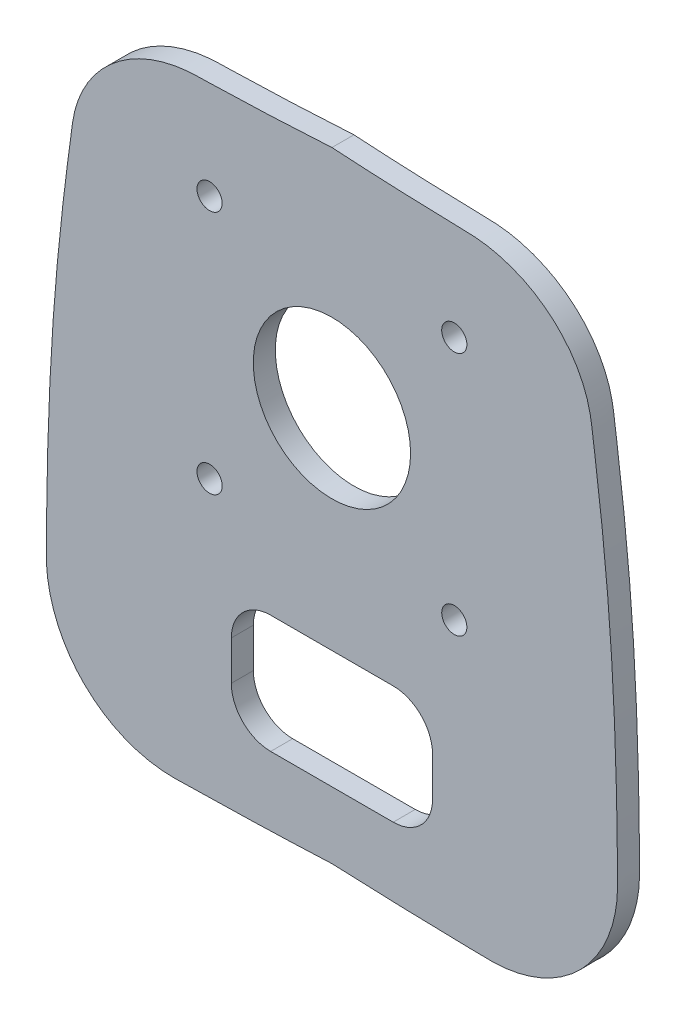
ISO-10303-21;
HEADER;
FILE_DESCRIPTION(('STEP AP214'),'2;1');
FILE_NAME('part.step','',(''),(''),'','','');
FILE_SCHEMA(('AUTOMOTIVE_DESIGN { 1 0 10303 214 1 1 1 1 }'));
ENDSEC;
DATA;
#1=APPLICATION_CONTEXT('core data for automotive mechanical design processes');
#2=APPLICATION_PROTOCOL_DEFINITION('international standard','automotive_design',2000,#1);
#3=PRODUCT_CONTEXT('',#1,'mechanical');
#4=PRODUCT('Part','Part','',(#3));
#5=PRODUCT_RELATED_PRODUCT_CATEGORY('part','',(#4));
#6=PRODUCT_DEFINITION_FORMATION('','',#4);
#7=PRODUCT_DEFINITION_CONTEXT('part definition',#1,'design');
#8=PRODUCT_DEFINITION('design','',#6,#7);
#9=PRODUCT_DEFINITION_SHAPE('','',#8);
#10=(LENGTH_UNIT() NAMED_UNIT(*) SI_UNIT(.MILLI.,.METRE.));
#11=(NAMED_UNIT(*) PLANE_ANGLE_UNIT() SI_UNIT($,.RADIAN.));
#12=(NAMED_UNIT(*) SI_UNIT($,.STERADIAN.) SOLID_ANGLE_UNIT());
#13=UNCERTAINTY_MEASURE_WITH_UNIT(LENGTH_MEASURE(1.E-05),#10,'distance_accuracy_value','');
#14=(GEOMETRIC_REPRESENTATION_CONTEXT(3) GLOBAL_UNCERTAINTY_ASSIGNED_CONTEXT((#13)) GLOBAL_UNIT_ASSIGNED_CONTEXT((#10,
#11,#12)) REPRESENTATION_CONTEXT('',''));
#15=CARTESIAN_POINT('',(0.,0.,0.));
#16=DIRECTION('',(0.,0.,1.));
#17=DIRECTION('',(1.,0.,0.));
#18=AXIS2_PLACEMENT_3D('',#15,#16,#17);
#19=CARTESIAN_POINT('',(35.7377884976635,90.9243480503008,1.4));
#20=DIRECTION('',(0.,0.,-1.));
#21=DIRECTION('',(-1.,0.,0.));
#22=AXIS2_PLACEMENT_3D('',#19,#20,#21);
#23=PLANE('',#22);
#24=CARTESIAN_POINT('',(0.,103.636945020621,1.4));
#25=DIRECTION('',(0.,0.,1.));
#26=DIRECTION('',(1.,0.,0.));
#27=AXIS2_PLACEMENT_3D('',#24,#25,#26);
#28=CIRCLE('',#27,10.);
#29=CARTESIAN_POINT('',(10.,103.636945020621,1.4));
#30=VERTEX_POINT('',#29);
#31=EDGE_CURVE('E181',#30,#30,#28,.T.);
#32=ORIENTED_EDGE('',*,*,#31,.F.);
#33=EDGE_LOOP('',(#32));
#34=FACE_BOUND('',#33,.T.);
#35=CARTESIAN_POINT('',(-0.000283533058010957,53.4701698079272,1.4));
#36=CARTESIAN_POINT('',(2.754094637823,53.3406541040463,1.4));
#37=CARTESIAN_POINT('',(6.88852234929573,53.183893834403,1.4));
#38=CARTESIAN_POINT('',(12.3984950227997,53.0312207026691,1.4));
#39=CARTESIAN_POINT('',(15.8450651750415,52.9452512085923,1.4));
#40=CARTESIAN_POINT('',(18.5915827563011,52.8971053042139,1.4));
#41=CARTESIAN_POINT('',(20.6922850078379,52.8377667341239,1.4));
#42=CARTESIAN_POINT('',(22.873716388646,53.0530362099297,1.4));
#43=CARTESIAN_POINT('',(25.6946529637316,53.7197826564024,1.4));
#44=CARTESIAN_POINT('',(29.0166475683748,55.2561065746141,1.4));
#45=CARTESIAN_POINT('',(32.3622850895535,58.1264972905668,1.4));
#46=CARTESIAN_POINT('',(34.8013740710264,61.7884024294738,1.4));
#47=CARTESIAN_POINT('',(35.9541820280247,65.2517096552818,1.4));
#48=CARTESIAN_POINT('',(36.2828488982131,67.7579033606365,1.4));
#49=CARTESIAN_POINT('',(36.3304551030955,69.210327921756,1.4));
#50=CARTESIAN_POINT('',(36.3105937768182,70.5941669672662,1.4));
#51=CARTESIAN_POINT('',(36.3028809484655,72.3121382635295,1.4));
#52=CARTESIAN_POINT('',(36.2676735142839,75.0712758014928,1.4));
#53=CARTESIAN_POINT('',(36.2077757255966,78.5170817517302,1.4));
#54=CARTESIAN_POINT('',(36.0605604318214,84.0322566083403,1.4));
#55=CARTESIAN_POINT('',(35.7736104123644,90.9254905309899,1.4));
#56=CARTESIAN_POINT('',(35.2143389008104,99.1905163540348,1.4));
#57=CARTESIAN_POINT('',(34.5483788320257,106.061434048461,1.4));
#58=CARTESIAN_POINT('',(33.9888342033768,110.858715847511,1.4));
#59=CARTESIAN_POINT('',(33.6446218230346,113.59677398623,1.4));
#60=CARTESIAN_POINT('',(33.378644687389,115.647528005347,1.4));
#61=CARTESIAN_POINT('',(33.1393797532476,117.358397487172,1.4));
#62=CARTESIAN_POINT('',(32.9655936586619,118.719380489424,1.4));
#63=CARTESIAN_POINT('',(32.6910933327782,120.178069098621,1.4));
#64=CARTESIAN_POINT('',(32.1308855859811,121.911840068862,1.4));
#65=CARTESIAN_POINT('',(30.8198176873757,124.531737314675,1.4));
#66=CARTESIAN_POINT('',(28.486038903255,127.370991378506,1.4));
#67=CARTESIAN_POINT('',(24.8790731283998,129.873567663352,1.4));
#68=CARTESIAN_POINT('',(21.4570275098434,131.104440234849,1.4));
#69=CARTESIAN_POINT('',(18.5976595320673,131.578755820447,1.4));
#70=CARTESIAN_POINT('',(16.4534090513971,131.629242827364,1.4));
#71=CARTESIAN_POINT('',(14.4184371394189,131.677774081752,1.4));
#72=CARTESIAN_POINT('',(11.6632338332419,131.76032225866,1.4));
#73=CARTESIAN_POINT('',(8.23423005028996,131.887755690486,1.4));
#74=CARTESIAN_POINT('',(4.11559803076173,132.078915649533,1.4));
#75=CARTESIAN_POINT('',(1.37171729679568,132.239382829802,1.4));
#76=CARTESIAN_POINT('',(-1.77041096705691E-05,132.322927633807,1.4));
#77=B_SPLINE_CURVE_WITH_KNOTS('',3,(#35,#36,#37,#38,#39,#40,#41,#42,#43,#44,#45,#46,#47,#48,#49,
#50,#51,#52,#53,#54,#55,#56,#57,#58,#59,#60,#61,#62,#63,#64,#65,#66,#67,#68,#69,#70,#71,#72,#73,
#74,#75,#76),.UNSPECIFIED.,.F.,.F.,(4,1,1,1,1,1,1,1,1,1,1,1,1,1,1,1,1,1,1,1,1,1,1,1,1,1,1,1,1,1,
1,1,1,1,1,1,1,1,1,4),(0.000282509675839851,0.0627879049323202,0.0940406025605603,
0.125293300188801,0.140919649002921,0.156545997817041,0.172172346631161,0.187798695445281,
0.219051393073521,0.250304090701761,0.281556788330001,0.312809485958242,0.328435834772362,
0.336249009179422,0.344062183586482,0.359688532400602,0.375314881214722,0.406567578842962,
0.437820276471202,0.500325671727682,0.562831066984163,0.625336462240643,0.656589159868883,
0.672215508683003,0.687841857497123,0.703468206311244,0.711281380718304,0.719094555125364,
0.734720903939484,0.750347252753604,0.781599950381844,0.812852648010084,0.844105345638324,
0.859731694452444,0.875358043266564,0.890984392080684,0.906610740894805,0.937863438523045,
0.969116136151285,1.00036883377953),.UNSPECIFIED.);
#78=CARTESIAN_POINT('',(-0.000283533058021583,53.4701698079272,1.4));
#79=VERTEX_POINT('',#78);
#80=CARTESIAN_POINT('',(-1.77041098693102E-05,132.322927633807,1.4));
#81=VERTEX_POINT('',#80);
#82=EDGE_CURVE('E186',#79,#81,#77,.T.);
#83=ORIENTED_EDGE('',*,*,#82,.T.);
#84=CARTESIAN_POINT('',(-1.77041098693102E-05,132.322927633807,1.4));
#85=CARTESIAN_POINT('',(-1.37176075115079,132.23932151345,1.4));
#86=CARTESIAN_POINT('',(-4.11587540156099,132.078848463856,1.4));
#87=CARTESIAN_POINT('',(-8.23362328038107,131.888165414702,1.4));
#88=CARTESIAN_POINT('',(-11.6659715045283,131.758996412906,1.4));
#89=CARTESIAN_POINT('',(-14.4145638193451,131.679991988209,1.4));
#90=CARTESIAN_POINT('',(-16.1260603021483,131.631310781155,1.4));
#91=CARTESIAN_POINT('',(-17.5114793050363,131.613771321968,1.4));
#92=CARTESIAN_POINT('',(-18.9640952218299,131.513752966204,1.4));
#93=CARTESIAN_POINT('',(-21.4515776609054,131.108256854622,1.4));
#94=CARTESIAN_POINT('',(-24.8803253816797,129.873214022638,1.4));
#95=CARTESIAN_POINT('',(-28.494127817679,127.363991241677,1.4));
#96=CARTESIAN_POINT('',(-30.8292720517559,124.518578914678,1.4));
#97=CARTESIAN_POINT('',(-32.1363647709037,121.897378478795,1.4));
#98=CARTESIAN_POINT('',(-32.6962266946872,120.162658078926,1.4));
#99=CARTESIAN_POINT('',(-32.9664110684567,118.7029847149,1.4));
#100=CARTESIAN_POINT('',(-33.1422346195259,117.341838907959,1.4));
#101=CARTESIAN_POINT('',(-33.3804213762451,115.631916907388,1.4));
#102=CARTESIAN_POINT('',(-33.6466758903563,113.58096716651,1.4));
#103=CARTESIAN_POINT('',(-33.99074912214,110.842843943667,1.4));
#104=CARTESIAN_POINT('',(-34.5500863861577,106.045428383949,1.4));
#105=CARTESIAN_POINT('',(-35.2156509032981,99.1744399089664,1.4));
#106=CARTESIAN_POINT('',(-35.774491941237,90.9091684935974,1.4));
#107=CARTESIAN_POINT('',(-36.0611778972659,84.0160683536409,1.4));
#108=CARTESIAN_POINT('',(-36.2081124484806,78.5010123774302,1.4));
#109=CARTESIAN_POINT('',(-36.2684526321832,75.0539366464581,1.4));
#110=CARTESIAN_POINT('',(-36.3022123007736,72.2974748530917,1.4));
#111=CARTESIAN_POINT('',(-36.3124203976063,70.5714249889453,1.4));
#112=CARTESIAN_POINT('',(-36.3292074375497,69.1993889459023,1.4));
#113=CARTESIAN_POINT('',(-36.2822587033248,67.7357589315949,1.4));
#114=CARTESIAN_POINT('',(-35.949444134567,65.2376514812232,1.4));
#115=CARTESIAN_POINT('',(-34.792194189897,61.7687068712952,1.4));
#116=CARTESIAN_POINT('',(-32.3552465185014,58.1209675864692,1.4));
#117=CARTESIAN_POINT('',(-29.0185571382697,55.2586024789574,1.4));
#118=CARTESIAN_POINT('',(-25.69909962563,53.7195724405076,1.4));
#119=CARTESIAN_POINT('',(-22.8688452038071,53.0539058568493,1.4));
#120=CARTESIAN_POINT('',(-21.0709893086204,52.8713798078184,1.4));
#121=CARTESIAN_POINT('',(-19.6219086483146,52.8720367571351,1.4));
#122=CARTESIAN_POINT('',(-18.26031434006,52.900316329457,1.4));
#123=CARTESIAN_POINT('',(-15.8369952122122,52.9472540701711,1.4));
#124=CARTESIAN_POINT('',(-12.4015578472232,53.0306443546203,1.4));
#125=CARTESIAN_POINT('',(-6.88688779419521,53.1838100654355,1.4));
#126=CARTESIAN_POINT('',(-2.75462126798742,53.3426090337493,1.4));
#127=CARTESIAN_POINT('',(-0.000283533058021583,53.4701698079272,1.4));
#128=B_SPLINE_CURVE_WITH_KNOTS('',3,(#84,#85,#86,#87,#88,#89,#90,#91,#92,#93,#94,#95,#96,#97,
#98,#99,#100,#101,#102,#103,#104,#105,#106,#107,#108,#109,#110,#111,#112,#113,#114,#115,#116,
#117,#118,#119,#120,#121,#122,#123,#124,#125,#126,#127),.UNSPECIFIED.,.F.,.F.,(4,1,1,1,1,1,1,1,
1,1,1,1,1,1,1,1,1,1,1,1,1,1,1,1,1,1,1,1,1,1,1,1,1,1,1,1,1,1,1,1,1,4),(-0.000368826145698764,
0.0308838713398925,0.0621365688254838,0.093389266311075,0.109015615053871,0.124641963796666,
0.132455138168064,0.140268312539462,0.155894661282258,0.187147358767849,0.21840005625344,
0.249652753739031,0.265279102481827,0.280905451224623,0.28871862559602,0.296531799967418,
0.312158148710214,0.32778449745301,0.343410846195805,0.374663543681396,0.437168938652579,
0.499674333623762,0.562179728594944,0.593432426080535,0.624685123566127,0.640311472308922,
0.655937821051718,0.663750995423116,0.671564169794514,0.687190518537309,0.7184432160229,
0.749695913508492,0.780948610994083,0.812201308479674,0.82782765722247,0.843454005965266,
0.851267180336663,0.859080354708061,0.874706703450857,0.905959400936448,0.937212098422039,
0.999717493393222),.UNSPECIFIED.);
#129=EDGE_CURVE('E192',#81,#79,#128,.T.);
#130=ORIENTED_EDGE('',*,*,#129,.T.);
#131=EDGE_LOOP('',(#83,#130));
#132=FACE_BOUND('',#131,.T.);
#133=CARTESIAN_POINT('',(7.79119480420832,66.9339694059778,1.4));
#134=DIRECTION('',(0.,0.,1.));
#135=DIRECTION('',(1.,0.,0.));
#136=AXIS2_PLACEMENT_3D('',#133,#134,#135);
#137=CIRCLE('',#136,5.);
#138=CARTESIAN_POINT('',(7.79119480420832,61.9339694059778,1.4));
#139=VERTEX_POINT('',#138);
#140=CARTESIAN_POINT('',(12.7911948042083,66.9339694059778,1.4));
#141=VERTEX_POINT('',#140);
#142=EDGE_CURVE('E113',#139,#141,#137,.T.);
#143=ORIENTED_EDGE('',*,*,#142,.F.);
#144=DIRECTION('',(1.,0.,0.));
#145=VECTOR('',#144,1.);
#146=CARTESIAN_POINT('',(-7.79119480420832,61.9339694059778,1.4));
#147=LINE('',#146,#145);
#148=CARTESIAN_POINT('',(-7.79119480420831,61.9339694059778,1.4));
#149=VERTEX_POINT('',#148);
#150=EDGE_CURVE('E148',#149,#139,#147,.T.);
#151=ORIENTED_EDGE('',*,*,#150,.F.);
#152=CARTESIAN_POINT('',(-7.79119480420832,66.9339694059778,1.4));
#153=DIRECTION('',(0.,0.,1.));
#154=DIRECTION('',(-1.,0.,0.));
#155=AXIS2_PLACEMENT_3D('',#152,#153,#154);
#156=CIRCLE('',#155,5.);
#157=CARTESIAN_POINT('',(-12.7911948042083,66.9339694059778,1.4));
#158=VERTEX_POINT('',#157);
#159=EDGE_CURVE('E146',#158,#149,#156,.T.);
#160=ORIENTED_EDGE('',*,*,#159,.F.);
#161=DIRECTION('',(0.,-1.,0.));
#162=VECTOR('',#161,1.);
#163=CARTESIAN_POINT('',(-12.7911948042083,66.9339694059778,1.4));
#164=LINE('',#163,#162);
#165=CARTESIAN_POINT('',(-12.7911948042083,71.9339694059778,1.4));
#166=VERTEX_POINT('',#165);
#167=EDGE_CURVE('E144',#166,#158,#164,.T.);
#168=ORIENTED_EDGE('',*,*,#167,.F.);
#169=CARTESIAN_POINT('',(-7.79119480420832,71.9339694059778,1.4));
#170=DIRECTION('',(0.,0.,1.));
#171=DIRECTION('',(-1.,0.,0.));
#172=AXIS2_PLACEMENT_3D('',#169,#170,#171);
#173=CIRCLE('',#172,5.);
#174=CARTESIAN_POINT('',(-7.79119480420832,76.9339694059778,1.4));
#175=VERTEX_POINT('',#174);
#176=EDGE_CURVE('E142',#175,#166,#173,.T.);
#177=ORIENTED_EDGE('',*,*,#176,.F.);
#178=DIRECTION('',(-1.,0.,0.));
#179=VECTOR('',#178,1.);
#180=CARTESIAN_POINT('',(-7.79119480420832,76.9339694059778,1.4));
#181=LINE('',#180,#179);
#182=CARTESIAN_POINT('',(7.79119480420832,76.9339694059778,1.4));
#183=VERTEX_POINT('',#182);
#184=EDGE_CURVE('E137',#183,#175,#181,.T.);
#185=ORIENTED_EDGE('',*,*,#184,.F.);
#186=CARTESIAN_POINT('',(7.79119480420832,71.9339694059778,1.4));
#187=DIRECTION('',(0.,0.,1.));
#188=DIRECTION('',(-1.,0.,0.));
#189=AXIS2_PLACEMENT_3D('',#186,#187,#188);
#190=CIRCLE('',#189,5.);
#191=CARTESIAN_POINT('',(12.7911948042083,71.9339694059778,1.4));
#192=VERTEX_POINT('',#191);
#193=EDGE_CURVE('E135',#192,#183,#190,.T.);
#194=ORIENTED_EDGE('',*,*,#193,.F.);
#195=DIRECTION('',(0.,1.,0.));
#196=VECTOR('',#195,1.);
#197=CARTESIAN_POINT('',(12.7911948042083,66.9339694059778,1.4));
#198=LINE('',#197,#196);
#199=EDGE_CURVE('E121',#141,#192,#198,.T.);
#200=ORIENTED_EDGE('',*,*,#199,.F.);
#201=EDGE_LOOP('',(#143,#151,#160,#168,#177,#185,#194,#200));
#202=FACE_BOUND('',#201,.T.);
#203=CARTESIAN_POINT('',(15.556349186104,119.193294206725,1.4));
#204=DIRECTION('',(0.,0.,1.));
#205=DIRECTION('',(1.,0.,0.));
#206=AXIS2_PLACEMENT_3D('',#203,#204,#205);
#207=CIRCLE('',#206,1.6);
#208=CARTESIAN_POINT('',(17.1563491861041,119.193294206725,1.4));
#209=VERTEX_POINT('',#208);
#210=EDGE_CURVE('E151',#209,#209,#207,.T.);
#211=ORIENTED_EDGE('',*,*,#210,.F.);
#212=EDGE_LOOP('',(#211));
#213=FACE_BOUND('',#212,.T.);
#214=CARTESIAN_POINT('',(-15.5567682017263,119.193608402585,1.4));
#215=DIRECTION('',(0.,0.,1.));
#216=DIRECTION('',(-1.,0.,0.));
#217=AXIS2_PLACEMENT_3D('',#214,#215,#216);
#218=CIRCLE('',#217,1.6);
#219=CARTESIAN_POINT('',(-17.1567682017263,119.193608402585,1.4));
#220=VERTEX_POINT('',#219);
#221=EDGE_CURVE('E284',#220,#220,#218,.T.);
#222=ORIENTED_EDGE('',*,*,#221,.F.);
#223=EDGE_LOOP('',(#222));
#224=FACE_BOUND('',#223,.T.);
#225=CARTESIAN_POINT('',(-15.5567682017263,88.0802816386559,1.4));
#226=DIRECTION('',(0.,0.,1.));
#227=DIRECTION('',(1.,0.,0.));
#228=AXIS2_PLACEMENT_3D('',#225,#226,#227);
#229=CIRCLE('',#228,1.6);
#230=CARTESIAN_POINT('',(-13.9567682017263,88.0802816386559,1.4));
#231=VERTEX_POINT('',#230);
#232=EDGE_CURVE('E278',#231,#231,#229,.T.);
#233=ORIENTED_EDGE('',*,*,#232,.F.);
#234=EDGE_LOOP('',(#233));
#235=FACE_BOUND('',#234,.T.);
#236=CARTESIAN_POINT('',(15.556349186104,88.0805958345165,1.4));
#237=DIRECTION('',(0.,0.,1.));
#238=DIRECTION('',(-1.,0.,0.));
#239=AXIS2_PLACEMENT_3D('',#236,#237,#238);
#240=CIRCLE('',#239,1.6);
#241=CARTESIAN_POINT('',(13.956349186104,88.0805958345165,1.4));
#242=VERTEX_POINT('',#241);
#243=EDGE_CURVE('E269',#242,#242,#240,.T.);
#244=ORIENTED_EDGE('',*,*,#243,.F.);
#245=EDGE_LOOP('',(#244));
#246=FACE_BOUND('',#245,.T.);
#247=ADVANCED_FACE('F35',(#34,#132,#202,#213,#224,#235,#246),#23,.F.);
#248=CARTESIAN_POINT('',(35.7377884976635,90.9243480503008,-1.4));
#249=DIRECTION('',(0.,0.,-1.));
#250=DIRECTION('',(-1.,0.,0.));
#251=AXIS2_PLACEMENT_3D('',#248,#249,#250);
#252=PLANE('',#251);
#253=CARTESIAN_POINT('',(-15.5567682017263,88.0802816386559,-1.4));
#254=DIRECTION('',(0.,0.,1.));
#255=DIRECTION('',(1.,0.,0.));
#256=AXIS2_PLACEMENT_3D('',#253,#254,#255);
#257=CIRCLE('',#256,1.6);
#258=CARTESIAN_POINT('',(-13.9567682017263,88.0802816386559,-1.4));
#259=VERTEX_POINT('',#258);
#260=EDGE_CURVE('E275',#259,#259,#257,.T.);
#261=ORIENTED_EDGE('',*,*,#260,.T.);
#262=EDGE_LOOP('',(#261));
#263=FACE_BOUND('',#262,.T.);
#264=CARTESIAN_POINT('',(15.556349186104,119.193294206725,-1.4));
#265=DIRECTION('',(0.,0.,1.));
#266=DIRECTION('',(1.,0.,0.));
#267=AXIS2_PLACEMENT_3D('',#264,#265,#266);
#268=CIRCLE('',#267,1.6);
#269=CARTESIAN_POINT('',(17.1563491861041,119.193294206725,-1.4));
#270=VERTEX_POINT('',#269);
#271=EDGE_CURVE('E287',#270,#270,#268,.T.);
#272=ORIENTED_EDGE('',*,*,#271,.T.);
#273=EDGE_LOOP('',(#272));
#274=FACE_BOUND('',#273,.T.);
#275=CARTESIAN_POINT('',(-0.000283533058010957,53.4701698079272,-1.4));
#276=CARTESIAN_POINT('',(2.754094637823,53.3406541040463,-1.4));
#277=CARTESIAN_POINT('',(6.88852234929573,53.183893834403,-1.4));
#278=CARTESIAN_POINT('',(12.3984950227997,53.0312207026691,-1.4));
#279=CARTESIAN_POINT('',(15.8450651750415,52.9452512085923,-1.4));
#280=CARTESIAN_POINT('',(18.5915827563011,52.8971053042139,-1.4));
#281=CARTESIAN_POINT('',(20.6922850078379,52.8377667341239,-1.4));
#282=CARTESIAN_POINT('',(22.873716388646,53.0530362099297,-1.4));
#283=CARTESIAN_POINT('',(25.6946529637316,53.7197826564024,-1.4));
#284=CARTESIAN_POINT('',(29.0166475683748,55.2561065746141,-1.4));
#285=CARTESIAN_POINT('',(32.3622850895535,58.1264972905668,-1.4));
#286=CARTESIAN_POINT('',(34.8013740710264,61.7884024294738,-1.4));
#287=CARTESIAN_POINT('',(35.9541820280247,65.2517096552818,-1.4));
#288=CARTESIAN_POINT('',(36.2828488982131,67.7579033606365,-1.4));
#289=CARTESIAN_POINT('',(36.3304551030955,69.210327921756,-1.4));
#290=CARTESIAN_POINT('',(36.3105937768182,70.5941669672662,-1.4));
#291=CARTESIAN_POINT('',(36.3028809484655,72.3121382635295,-1.4));
#292=CARTESIAN_POINT('',(36.2676735142839,75.0712758014928,-1.4));
#293=CARTESIAN_POINT('',(36.2077757255966,78.5170817517302,-1.4));
#294=CARTESIAN_POINT('',(36.0605604318214,84.0322566083403,-1.4));
#295=CARTESIAN_POINT('',(35.7736104123644,90.9254905309899,-1.4));
#296=CARTESIAN_POINT('',(35.2143389008104,99.1905163540348,-1.4));
#297=CARTESIAN_POINT('',(34.5483788320257,106.061434048461,-1.4));
#298=CARTESIAN_POINT('',(33.9888342033768,110.858715847511,-1.4));
#299=CARTESIAN_POINT('',(33.6446218230346,113.59677398623,-1.4));
#300=CARTESIAN_POINT('',(33.378644687389,115.647528005347,-1.4));
#301=CARTESIAN_POINT('',(33.1393797532476,117.358397487172,-1.4));
#302=CARTESIAN_POINT('',(32.9655936586619,118.719380489424,-1.4));
#303=CARTESIAN_POINT('',(32.6910933327782,120.178069098621,-1.4));
#304=CARTESIAN_POINT('',(32.1308855859811,121.911840068862,-1.4));
#305=CARTESIAN_POINT('',(30.8198176873757,124.531737314675,-1.4));
#306=CARTESIAN_POINT('',(28.486038903255,127.370991378506,-1.4));
#307=CARTESIAN_POINT('',(24.8790731283998,129.873567663352,-1.4));
#308=CARTESIAN_POINT('',(21.4570275098434,131.104440234849,-1.4));
#309=CARTESIAN_POINT('',(18.5976595320673,131.578755820447,-1.4));
#310=CARTESIAN_POINT('',(16.4534090513971,131.629242827364,-1.4));
#311=CARTESIAN_POINT('',(14.4184371394189,131.677774081752,-1.4));
#312=CARTESIAN_POINT('',(11.6632338332419,131.76032225866,-1.4));
#313=CARTESIAN_POINT('',(8.23423005028996,131.887755690486,-1.4));
#314=CARTESIAN_POINT('',(4.11559803076173,132.078915649533,-1.4));
#315=CARTESIAN_POINT('',(1.37171729679568,132.239382829802,-1.4));
#316=CARTESIAN_POINT('',(-1.77041096705691E-05,132.322927633807,-1.4));
#317=B_SPLINE_CURVE_WITH_KNOTS('',3,(#275,#276,#277,#278,#279,#280,#281,#282,#283,#284,#285,
#286,#287,#288,#289,#290,#291,#292,#293,#294,#295,#296,#297,#298,#299,#300,#301,#302,#303,#304,
#305,#306,#307,#308,#309,#310,#311,#312,#313,#314,#315,#316),.UNSPECIFIED.,.F.,.F.,(4,1,1,1,1,1,
1,1,1,1,1,1,1,1,1,1,1,1,1,1,1,1,1,1,1,1,1,1,1,1,1,1,1,1,1,1,1,1,1,4),(0.000282509675839851,
0.0627879049323202,0.0940406025605603,0.125293300188801,0.140919649002921,0.156545997817041,
0.172172346631161,0.187798695445281,0.219051393073521,0.250304090701761,0.281556788330001,
0.312809485958242,0.328435834772362,0.336249009179422,0.344062183586482,0.359688532400602,
0.375314881214722,0.406567578842962,0.437820276471202,0.500325671727682,0.562831066984163,
0.625336462240643,0.656589159868883,0.672215508683003,0.687841857497123,0.703468206311244,
0.711281380718304,0.719094555125364,0.734720903939484,0.750347252753604,0.781599950381844,
0.812852648010084,0.844105345638324,0.859731694452444,0.875358043266564,0.890984392080684,
0.906610740894805,0.937863438523045,0.969116136151285,1.00036883377953),.UNSPECIFIED.);
#318=CARTESIAN_POINT('',(-0.000283533058021583,53.4701698079272,-1.4));
#319=VERTEX_POINT('',#318);
#320=CARTESIAN_POINT('',(-1.77041098693102E-05,132.322927633807,-1.4));
#321=VERTEX_POINT('',#320);
#322=EDGE_CURVE('E184',#319,#321,#317,.T.);
#323=ORIENTED_EDGE('',*,*,#322,.F.);
#324=CARTESIAN_POINT('',(-1.77041098693102E-05,132.322927633807,-1.4));
#325=CARTESIAN_POINT('',(-1.37176075115079,132.23932151345,-1.4));
#326=CARTESIAN_POINT('',(-4.11587540156099,132.078848463856,-1.4));
#327=CARTESIAN_POINT('',(-8.23362328038107,131.888165414702,-1.4));
#328=CARTESIAN_POINT('',(-11.6659715045283,131.758996412906,-1.4));
#329=CARTESIAN_POINT('',(-14.4145638193451,131.679991988209,-1.4));
#330=CARTESIAN_POINT('',(-16.1260603021483,131.631310781155,-1.4));
#331=CARTESIAN_POINT('',(-17.5114793050363,131.613771321968,-1.4));
#332=CARTESIAN_POINT('',(-18.9640952218299,131.513752966204,-1.4));
#333=CARTESIAN_POINT('',(-21.4515776609054,131.108256854622,-1.4));
#334=CARTESIAN_POINT('',(-24.8803253816797,129.873214022638,-1.4));
#335=CARTESIAN_POINT('',(-28.494127817679,127.363991241677,-1.4));
#336=CARTESIAN_POINT('',(-30.8292720517559,124.518578914678,-1.4));
#337=CARTESIAN_POINT('',(-32.1363647709037,121.897378478795,-1.4));
#338=CARTESIAN_POINT('',(-32.6962266946872,120.162658078926,-1.4));
#339=CARTESIAN_POINT('',(-32.9664110684567,118.7029847149,-1.4));
#340=CARTESIAN_POINT('',(-33.1422346195259,117.341838907959,-1.4));
#341=CARTESIAN_POINT('',(-33.3804213762451,115.631916907388,-1.4));
#342=CARTESIAN_POINT('',(-33.6466758903563,113.58096716651,-1.4));
#343=CARTESIAN_POINT('',(-33.99074912214,110.842843943667,-1.4));
#344=CARTESIAN_POINT('',(-34.5500863861577,106.045428383949,-1.4));
#345=CARTESIAN_POINT('',(-35.2156509032981,99.1744399089664,-1.4));
#346=CARTESIAN_POINT('',(-35.774491941237,90.9091684935974,-1.4));
#347=CARTESIAN_POINT('',(-36.0611778972659,84.0160683536409,-1.4));
#348=CARTESIAN_POINT('',(-36.2081124484806,78.5010123774302,-1.4));
#349=CARTESIAN_POINT('',(-36.2684526321832,75.0539366464581,-1.4));
#350=CARTESIAN_POINT('',(-36.3022123007736,72.2974748530917,-1.4));
#351=CARTESIAN_POINT('',(-36.3124203976063,70.5714249889453,-1.4));
#352=CARTESIAN_POINT('',(-36.3292074375497,69.1993889459023,-1.4));
#353=CARTESIAN_POINT('',(-36.2822587033248,67.7357589315949,-1.4));
#354=CARTESIAN_POINT('',(-35.949444134567,65.2376514812232,-1.4));
#355=CARTESIAN_POINT('',(-34.792194189897,61.7687068712952,-1.4));
#356=CARTESIAN_POINT('',(-32.3552465185014,58.1209675864692,-1.4));
#357=CARTESIAN_POINT('',(-29.0185571382697,55.2586024789574,-1.4));
#358=CARTESIAN_POINT('',(-25.69909962563,53.7195724405076,-1.4));
#359=CARTESIAN_POINT('',(-22.8688452038071,53.0539058568493,-1.4));
#360=CARTESIAN_POINT('',(-21.0709893086204,52.8713798078184,-1.4));
#361=CARTESIAN_POINT('',(-19.6219086483146,52.8720367571351,-1.4));
#362=CARTESIAN_POINT('',(-18.26031434006,52.900316329457,-1.4));
#363=CARTESIAN_POINT('',(-15.8369952122122,52.9472540701711,-1.4));
#364=CARTESIAN_POINT('',(-12.4015578472232,53.0306443546203,-1.4));
#365=CARTESIAN_POINT('',(-6.88688779419521,53.1838100654355,-1.4));
#366=CARTESIAN_POINT('',(-2.75462126798742,53.3426090337493,-1.4));
#367=CARTESIAN_POINT('',(-0.000283533058021583,53.4701698079272,-1.4));
#368=B_SPLINE_CURVE_WITH_KNOTS('',3,(#324,#325,#326,#327,#328,#329,#330,#331,#332,#333,#334,
#335,#336,#337,#338,#339,#340,#341,#342,#343,#344,#345,#346,#347,#348,#349,#350,#351,#352,#353,
#354,#355,#356,#357,#358,#359,#360,#361,#362,#363,#364,#365,#366,#367),.UNSPECIFIED.,.F.,.F.,(4,
1,1,1,1,1,1,1,1,1,1,1,1,1,1,1,1,1,1,1,1,1,1,1,1,1,1,1,1,1,1,1,1,1,1,1,1,1,1,1,1,4),
(-0.000368826145698764,0.0308838713398925,0.0621365688254838,0.093389266311075,
0.109015615053871,0.124641963796666,0.132455138168064,0.140268312539462,0.155894661282258,
0.187147358767849,0.21840005625344,0.249652753739031,0.265279102481827,0.280905451224623,
0.28871862559602,0.296531799967418,0.312158148710214,0.32778449745301,0.343410846195805,
0.374663543681396,0.437168938652579,0.499674333623762,0.562179728594944,0.593432426080535,
0.624685123566127,0.640311472308922,0.655937821051718,0.663750995423116,0.671564169794514,
0.687190518537309,0.7184432160229,0.749695913508492,0.780948610994083,0.812201308479674,
0.82782765722247,0.843454005965266,0.851267180336663,0.859080354708061,0.874706703450857,
0.905959400936448,0.937212098422039,0.999717493393222),.UNSPECIFIED.);
#369=EDGE_CURVE('E193',#321,#319,#368,.T.);
#370=ORIENTED_EDGE('',*,*,#369,.F.);
#371=EDGE_LOOP('',(#323,#370));
#372=FACE_BOUND('',#371,.T.);
#373=CARTESIAN_POINT('',(0.,103.636945020621,-1.4));
#374=DIRECTION('',(0.,0.,1.));
#375=DIRECTION('',(1.,0.,0.));
#376=AXIS2_PLACEMENT_3D('',#373,#374,#375);
#377=CIRCLE('',#376,10.);
#378=CARTESIAN_POINT('',(10.,103.636945020621,-1.4));
#379=VERTEX_POINT('',#378);
#380=EDGE_CURVE('E129',#379,#379,#377,.T.);
#381=ORIENTED_EDGE('',*,*,#380,.T.);
#382=EDGE_LOOP('',(#381));
#383=FACE_BOUND('',#382,.T.);
#384=DIRECTION('',(1.,0.,0.));
#385=VECTOR('',#384,1.);
#386=CARTESIAN_POINT('',(-7.79119480420832,61.9339694059778,-1.4));
#387=LINE('',#386,#385);
#388=CARTESIAN_POINT('',(-7.79119480420832,61.9339694059778,-1.4));
#389=VERTEX_POINT('',#388);
#390=CARTESIAN_POINT('',(7.79119480420832,61.9339694059778,-1.4));
#391=VERTEX_POINT('',#390);
#392=EDGE_CURVE('E122',#389,#391,#387,.T.);
#393=ORIENTED_EDGE('',*,*,#392,.T.);
#394=CARTESIAN_POINT('',(7.79119480420832,66.9339694059778,-1.4));
#395=DIRECTION('',(0.,0.,1.));
#396=DIRECTION('',(1.,0.,0.));
#397=AXIS2_PLACEMENT_3D('',#394,#395,#396);
#398=CIRCLE('',#397,5.);
#399=CARTESIAN_POINT('',(12.7911948042083,66.9339694059778,-1.4));
#400=VERTEX_POINT('',#399);
#401=EDGE_CURVE('E59',#391,#400,#398,.T.);
#402=ORIENTED_EDGE('',*,*,#401,.T.);
#403=DIRECTION('',(0.,1.,0.));
#404=VECTOR('',#403,1.);
#405=CARTESIAN_POINT('',(12.7911948042083,66.9339694059778,-1.4));
#406=LINE('',#405,#404);
#407=CARTESIAN_POINT('',(12.7911948042083,71.9339694059778,-1.4));
#408=VERTEX_POINT('',#407);
#409=EDGE_CURVE('E128',#400,#408,#406,.T.);
#410=ORIENTED_EDGE('',*,*,#409,.T.);
#411=CARTESIAN_POINT('',(7.79119480420832,71.9339694059778,-1.4));
#412=DIRECTION('',(0.,0.,1.));
#413=DIRECTION('',(-1.,0.,0.));
#414=AXIS2_PLACEMENT_3D('',#411,#412,#413);
#415=CIRCLE('',#414,5.);
#416=CARTESIAN_POINT('',(7.79119480420832,76.9339694059778,-1.4));
#417=VERTEX_POINT('',#416);
#418=EDGE_CURVE('E153',#408,#417,#415,.T.);
#419=ORIENTED_EDGE('',*,*,#418,.T.);
#420=DIRECTION('',(-1.,0.,0.));
#421=VECTOR('',#420,1.);
#422=CARTESIAN_POINT('',(-7.79119480420832,76.9339694059778,-1.4));
#423=LINE('',#422,#421);
#424=CARTESIAN_POINT('',(-7.79119480420832,76.9339694059778,-1.4));
#425=VERTEX_POINT('',#424);
#426=EDGE_CURVE('E156',#417,#425,#423,.T.);
#427=ORIENTED_EDGE('',*,*,#426,.T.);
#428=CARTESIAN_POINT('',(-7.79119480420832,71.9339694059778,-1.4));
#429=DIRECTION('',(0.,0.,1.));
#430=DIRECTION('',(-1.,0.,0.));
#431=AXIS2_PLACEMENT_3D('',#428,#429,#430);
#432=CIRCLE('',#431,5.);
#433=CARTESIAN_POINT('',(-12.7911948042083,71.9339694059778,-1.4));
#434=VERTEX_POINT('',#433);
#435=EDGE_CURVE('E159',#425,#434,#432,.T.);
#436=ORIENTED_EDGE('',*,*,#435,.T.);
#437=DIRECTION('',(0.,-1.,0.));
#438=VECTOR('',#437,1.);
#439=CARTESIAN_POINT('',(-12.7911948042083,66.9339694059778,-1.4));
#440=LINE('',#439,#438);
#441=CARTESIAN_POINT('',(-12.7911948042083,66.9339694059778,-1.4));
#442=VERTEX_POINT('',#441);
#443=EDGE_CURVE('E162',#434,#442,#440,.T.);
#444=ORIENTED_EDGE('',*,*,#443,.T.);
#445=CARTESIAN_POINT('',(-7.79119480420832,66.9339694059778,-1.4));
#446=DIRECTION('',(0.,0.,1.));
#447=DIRECTION('',(-1.,0.,0.));
#448=AXIS2_PLACEMENT_3D('',#445,#446,#447);
#449=CIRCLE('',#448,5.);
#450=EDGE_CURVE('E165',#442,#389,#449,.T.);
#451=ORIENTED_EDGE('',*,*,#450,.T.);
#452=EDGE_LOOP('',(#393,#402,#410,#419,#427,#436,#444,#451));
#453=FACE_BOUND('',#452,.T.);
#454=CARTESIAN_POINT('',(-15.5567682017263,119.193608402585,-1.4));
#455=DIRECTION('',(0.,0.,1.));
#456=DIRECTION('',(-1.,0.,0.));
#457=AXIS2_PLACEMENT_3D('',#454,#455,#456);
#458=CIRCLE('',#457,1.6);
#459=CARTESIAN_POINT('',(-17.1567682017263,119.193608402585,-1.4));
#460=VERTEX_POINT('',#459);
#461=EDGE_CURVE('E281',#460,#460,#458,.T.);
#462=ORIENTED_EDGE('',*,*,#461,.T.);
#463=EDGE_LOOP('',(#462));
#464=FACE_BOUND('',#463,.T.);
#465=CARTESIAN_POINT('',(15.556349186104,88.0805958345165,-1.4));
#466=DIRECTION('',(0.,0.,1.));
#467=DIRECTION('',(-1.,0.,0.));
#468=AXIS2_PLACEMENT_3D('',#465,#466,#467);
#469=CIRCLE('',#468,1.6);
#470=CARTESIAN_POINT('',(13.956349186104,88.0805958345165,-1.4));
#471=VERTEX_POINT('',#470);
#472=EDGE_CURVE('E272',#471,#471,#469,.T.);
#473=ORIENTED_EDGE('',*,*,#472,.T.);
#474=EDGE_LOOP('',(#473));
#475=FACE_BOUND('',#474,.T.);
#476=ADVANCED_FACE('F212',(#263,#274,#372,#383,#453,#464,#475),#252,.T.);
#477=DIRECTION('',(0.,0.,-1.));
#478=VECTOR('',#477,1.);
#479=SURFACE_OF_LINEAR_EXTRUSION('',#77,#478);
#480=ORIENTED_EDGE('',*,*,#322,.T.);
#481=DIRECTION('',(0.,0.,-1.));
#482=VECTOR('',#481,1.);
#483=CARTESIAN_POINT('',(-1.77041098693102E-05,132.322927633807,1.4));
#484=LINE('',#483,#482);
#485=EDGE_CURVE('E11',#81,#321,#484,.T.);
#486=ORIENTED_EDGE('',*,*,#485,.F.);
#487=ORIENTED_EDGE('',*,*,#82,.F.);
#488=DIRECTION('',(0.,0.,-1.));
#489=VECTOR('',#488,1.);
#490=CARTESIAN_POINT('',(-0.000283533058021583,53.4701698079272,1.4));
#491=LINE('',#490,#489);
#492=EDGE_CURVE('E44',#79,#319,#491,.T.);
#493=ORIENTED_EDGE('',*,*,#492,.T.);
#494=EDGE_LOOP('',(#480,#486,#487,#493));
#495=FACE_BOUND('',#494,.T.);
#496=ADVANCED_FACE('F37',(#495),#479,.F.);
#497=DIRECTION('',(0.,0.,-1.));
#498=VECTOR('',#497,1.);
#499=SURFACE_OF_LINEAR_EXTRUSION('',#128,#498);
#500=ORIENTED_EDGE('',*,*,#369,.T.);
#501=ORIENTED_EDGE('',*,*,#492,.F.);
#502=ORIENTED_EDGE('',*,*,#129,.F.);
#503=ORIENTED_EDGE('',*,*,#485,.T.);
#504=EDGE_LOOP('',(#500,#501,#502,#503));
#505=FACE_BOUND('',#504,.T.);
#506=ADVANCED_FACE('F207',(#505),#499,.F.);
#507=CARTESIAN_POINT('',(0.,103.636945020621,1.4));
#508=DIRECTION('',(0.,0.,-1.));
#509=DIRECTION('',(-1.,0.,0.));
#510=AXIS2_PLACEMENT_3D('',#507,#508,#509);
#511=CYLINDRICAL_SURFACE('',#510,10.);
#512=ORIENTED_EDGE('',*,*,#31,.T.);
#513=EDGE_LOOP('',(#512));
#514=FACE_BOUND('',#513,.T.);
#515=ORIENTED_EDGE('',*,*,#380,.F.);
#516=EDGE_LOOP('',(#515));
#517=FACE_BOUND('',#516,.T.);
#518=ADVANCED_FACE('F210',(#514,#517),#511,.F.);
#519=CARTESIAN_POINT('',(7.79119480420832,66.9339694059778,1.4));
#520=DIRECTION('',(0.,0.,-1.));
#521=DIRECTION('',(-1.,0.,0.));
#522=AXIS2_PLACEMENT_3D('',#519,#520,#521);
#523=CYLINDRICAL_SURFACE('',#522,5.);
#524=ORIENTED_EDGE('',*,*,#401,.F.);
#525=DIRECTION('',(0.,0.,-1.));
#526=VECTOR('',#525,1.);
#527=CARTESIAN_POINT('',(7.79119480420832,61.9339694059778,1.4));
#528=LINE('',#527,#526);
#529=EDGE_CURVE('E117',#139,#391,#528,.T.);
#530=ORIENTED_EDGE('',*,*,#529,.F.);
#531=ORIENTED_EDGE('',*,*,#142,.T.);
#532=DIRECTION('',(0.,0.,-1.));
#533=VECTOR('',#532,1.);
#534=CARTESIAN_POINT('',(12.7911948042083,66.9339694059778,1.4));
#535=LINE('',#534,#533);
#536=EDGE_CURVE('E116',#141,#400,#535,.T.);
#537=ORIENTED_EDGE('',*,*,#536,.T.);
#538=EDGE_LOOP('',(#524,#530,#531,#537));
#539=FACE_BOUND('',#538,.T.);
#540=ADVANCED_FACE('F115',(#539),#523,.F.);
#541=CARTESIAN_POINT('',(12.7911948042083,66.9339694059778,1.4));
#542=DIRECTION('',(-1.,0.,0.));
#543=DIRECTION('',(0.,0.,1.));
#544=AXIS2_PLACEMENT_3D('',#541,#542,#543);
#545=PLANE('',#544);
#546=ORIENTED_EDGE('',*,*,#409,.F.);
#547=ORIENTED_EDGE('',*,*,#536,.F.);
#548=ORIENTED_EDGE('',*,*,#199,.T.);
#549=DIRECTION('',(0.,0.,-1.));
#550=VECTOR('',#549,1.);
#551=CARTESIAN_POINT('',(12.7911948042083,71.9339694059778,1.4));
#552=LINE('',#551,#550);
#553=EDGE_CURVE('E130',#192,#408,#552,.T.);
#554=ORIENTED_EDGE('',*,*,#553,.T.);
#555=EDGE_LOOP('',(#546,#547,#548,#554));
#556=FACE_BOUND('',#555,.T.);
#557=ADVANCED_FACE('F125',(#556),#545,.T.);
#558=CARTESIAN_POINT('',(7.79119480420832,71.9339694059778,1.4));
#559=DIRECTION('',(0.,0.,-1.));
#560=DIRECTION('',(-1.,0.,0.));
#561=AXIS2_PLACEMENT_3D('',#558,#559,#560);
#562=CYLINDRICAL_SURFACE('',#561,5.);
#563=ORIENTED_EDGE('',*,*,#418,.F.);
#564=ORIENTED_EDGE('',*,*,#553,.F.);
#565=ORIENTED_EDGE('',*,*,#193,.T.);
#566=DIRECTION('',(0.,0.,-1.));
#567=VECTOR('',#566,1.);
#568=CARTESIAN_POINT('',(7.79119480420832,76.9339694059778,1.4));
#569=LINE('',#568,#567);
#570=EDGE_CURVE('E178',#183,#417,#569,.T.);
#571=ORIENTED_EDGE('',*,*,#570,.T.);
#572=EDGE_LOOP('',(#563,#564,#565,#571));
#573=FACE_BOUND('',#572,.T.);
#574=ADVANCED_FACE('F226',(#573),#562,.F.);
#575=CARTESIAN_POINT('',(-7.79119480420832,76.9339694059778,1.4));
#576=DIRECTION('',(0.,-1.,0.));
#577=DIRECTION('',(0.,0.,-1.));
#578=AXIS2_PLACEMENT_3D('',#575,#576,#577);
#579=PLANE('',#578);
#580=ORIENTED_EDGE('',*,*,#426,.F.);
#581=ORIENTED_EDGE('',*,*,#570,.F.);
#582=ORIENTED_EDGE('',*,*,#184,.T.);
#583=DIRECTION('',(0.,0.,-1.));
#584=VECTOR('',#583,1.);
#585=CARTESIAN_POINT('',(-7.79119480420832,76.9339694059778,1.4));
#586=LINE('',#585,#584);
#587=EDGE_CURVE('E176',#175,#425,#586,.T.);
#588=ORIENTED_EDGE('',*,*,#587,.T.);
#589=EDGE_LOOP('',(#580,#581,#582,#588));
#590=FACE_BOUND('',#589,.T.);
#591=ADVANCED_FACE('F229',(#590),#579,.T.);
#592=CARTESIAN_POINT('',(-7.79119480420832,71.9339694059778,1.4));
#593=DIRECTION('',(0.,0.,-1.));
#594=DIRECTION('',(-1.,0.,0.));
#595=AXIS2_PLACEMENT_3D('',#592,#593,#594);
#596=CYLINDRICAL_SURFACE('',#595,5.);
#597=ORIENTED_EDGE('',*,*,#435,.F.);
#598=ORIENTED_EDGE('',*,*,#587,.F.);
#599=ORIENTED_EDGE('',*,*,#176,.T.);
#600=DIRECTION('',(0.,0.,-1.));
#601=VECTOR('',#600,1.);
#602=CARTESIAN_POINT('',(-12.7911948042083,71.9339694059778,1.4));
#603=LINE('',#602,#601);
#604=EDGE_CURVE('E174',#166,#434,#603,.T.);
#605=ORIENTED_EDGE('',*,*,#604,.T.);
#606=EDGE_LOOP('',(#597,#598,#599,#605));
#607=FACE_BOUND('',#606,.T.);
#608=ADVANCED_FACE('F233',(#607),#596,.F.);
#609=CARTESIAN_POINT('',(-12.7911948042083,66.9339694059778,1.4));
#610=DIRECTION('',(1.,0.,0.));
#611=DIRECTION('',(0.,0.,-1.));
#612=AXIS2_PLACEMENT_3D('',#609,#610,#611);
#613=PLANE('',#612);
#614=ORIENTED_EDGE('',*,*,#443,.F.);
#615=ORIENTED_EDGE('',*,*,#604,.F.);
#616=ORIENTED_EDGE('',*,*,#167,.T.);
#617=DIRECTION('',(0.,0.,-1.));
#618=VECTOR('',#617,1.);
#619=CARTESIAN_POINT('',(-12.7911948042083,66.9339694059778,1.4));
#620=LINE('',#619,#618);
#621=EDGE_CURVE('E172',#158,#442,#620,.T.);
#622=ORIENTED_EDGE('',*,*,#621,.T.);
#623=EDGE_LOOP('',(#614,#615,#616,#622));
#624=FACE_BOUND('',#623,.T.);
#625=ADVANCED_FACE('F237',(#624),#613,.T.);
#626=CARTESIAN_POINT('',(-7.79119480420832,66.9339694059778,1.4));
#627=DIRECTION('',(0.,0.,-1.));
#628=DIRECTION('',(-1.,0.,0.));
#629=AXIS2_PLACEMENT_3D('',#626,#627,#628);
#630=CYLINDRICAL_SURFACE('',#629,5.);
#631=ORIENTED_EDGE('',*,*,#450,.F.);
#632=ORIENTED_EDGE('',*,*,#621,.F.);
#633=ORIENTED_EDGE('',*,*,#159,.T.);
#634=DIRECTION('',(0.,0.,-1.));
#635=VECTOR('',#634,1.);
#636=CARTESIAN_POINT('',(-7.79119480420832,61.9339694059778,1.4));
#637=LINE('',#636,#635);
#638=EDGE_CURVE('E51',#149,#389,#637,.T.);
#639=ORIENTED_EDGE('',*,*,#638,.T.);
#640=EDGE_LOOP('',(#631,#632,#633,#639));
#641=FACE_BOUND('',#640,.T.);
#642=ADVANCED_FACE('F241',(#641),#630,.F.);
#643=CARTESIAN_POINT('',(-7.79119480420832,61.9339694059778,1.4));
#644=DIRECTION('',(0.,1.,0.));
#645=DIRECTION('',(0.,0.,1.));
#646=AXIS2_PLACEMENT_3D('',#643,#644,#645);
#647=PLANE('',#646);
#648=ORIENTED_EDGE('',*,*,#392,.F.);
#649=ORIENTED_EDGE('',*,*,#638,.F.);
#650=ORIENTED_EDGE('',*,*,#150,.T.);
#651=ORIENTED_EDGE('',*,*,#529,.T.);
#652=EDGE_LOOP('',(#648,#649,#650,#651));
#653=FACE_BOUND('',#652,.T.);
#654=ADVANCED_FACE('F245',(#653),#647,.T.);
#655=CARTESIAN_POINT('',(15.556349186104,119.193294206725,1.4));
#656=DIRECTION('',(0.,0.,-1.));
#657=DIRECTION('',(-1.,0.,0.));
#658=AXIS2_PLACEMENT_3D('',#655,#656,#657);
#659=CYLINDRICAL_SURFACE('',#658,1.6);
#660=ORIENTED_EDGE('',*,*,#210,.T.);
#661=EDGE_LOOP('',(#660));
#662=FACE_BOUND('',#661,.T.);
#663=ORIENTED_EDGE('',*,*,#271,.F.);
#664=EDGE_LOOP('',(#663));
#665=FACE_BOUND('',#664,.T.);
#666=ADVANCED_FACE('F249',(#662,#665),#659,.F.);
#667=CARTESIAN_POINT('',(-15.5567682017263,119.193608402585,1.4));
#668=DIRECTION('',(0.,0.,-1.));
#669=DIRECTION('',(-1.,0.,0.));
#670=AXIS2_PLACEMENT_3D('',#667,#668,#669);
#671=CYLINDRICAL_SURFACE('',#670,1.6);
#672=ORIENTED_EDGE('',*,*,#221,.T.);
#673=EDGE_LOOP('',(#672));
#674=FACE_BOUND('',#673,.T.);
#675=ORIENTED_EDGE('',*,*,#461,.F.);
#676=EDGE_LOOP('',(#675));
#677=FACE_BOUND('',#676,.T.);
#678=ADVANCED_FACE('F252',(#674,#677),#671,.F.);
#679=CARTESIAN_POINT('',(-15.5567682017263,88.0802816386559,1.4));
#680=DIRECTION('',(0.,0.,-1.));
#681=DIRECTION('',(-1.,0.,0.));
#682=AXIS2_PLACEMENT_3D('',#679,#680,#681);
#683=CYLINDRICAL_SURFACE('',#682,1.6);
#684=ORIENTED_EDGE('',*,*,#232,.T.);
#685=EDGE_LOOP('',(#684));
#686=FACE_BOUND('',#685,.T.);
#687=ORIENTED_EDGE('',*,*,#260,.F.);
#688=EDGE_LOOP('',(#687));
#689=FACE_BOUND('',#688,.T.);
#690=ADVANCED_FACE('F256',(#686,#689),#683,.F.);
#691=CARTESIAN_POINT('',(15.556349186104,88.0805958345165,1.4));
#692=DIRECTION('',(0.,0.,-1.));
#693=DIRECTION('',(-1.,0.,0.));
#694=AXIS2_PLACEMENT_3D('',#691,#692,#693);
#695=CYLINDRICAL_SURFACE('',#694,1.6);
#696=ORIENTED_EDGE('',*,*,#243,.T.);
#697=EDGE_LOOP('',(#696));
#698=FACE_BOUND('',#697,.T.);
#699=ORIENTED_EDGE('',*,*,#472,.F.);
#700=EDGE_LOOP('',(#699));
#701=FACE_BOUND('',#700,.T.);
#702=ADVANCED_FACE('F260',(#698,#701),#695,.F.);
#703=CLOSED_SHELL('',(#247,#476,#496,#506,#518,#540,#557,#574,#591,#608,#625,#642,#654,#666,
#678,#690,#702));
#704=MANIFOLD_SOLID_BREP('B2',#703);
#705=ADVANCED_BREP_SHAPE_REPRESENTATION('',(#18,#704),#14);
#706=SHAPE_DEFINITION_REPRESENTATION(#9,#705);
ENDSEC;
END-ISO-10303-21;
